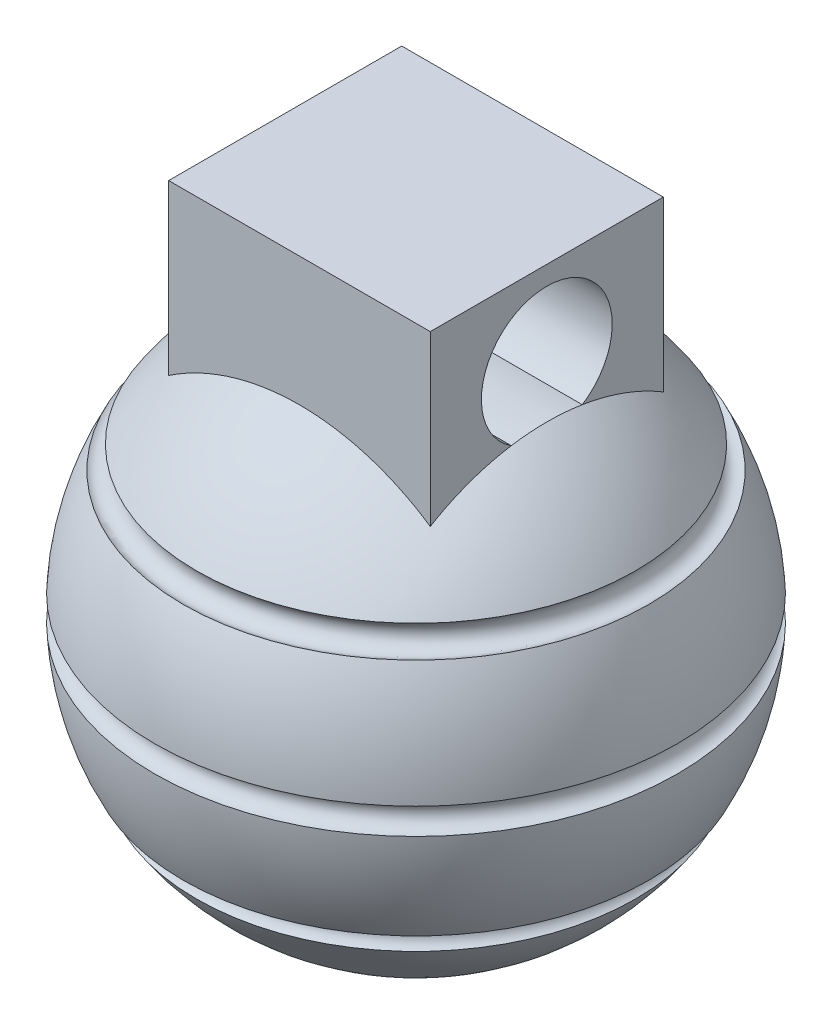
ISO-10303-21;
HEADER;
FILE_DESCRIPTION(('STEP AP214'),'2;1');
FILE_NAME('part.step','',(''),(''),'','','');
FILE_SCHEMA(('AUTOMOTIVE_DESIGN { 1 0 10303 214 1 1 1 1 }'));
ENDSEC;
DATA;
#1=APPLICATION_CONTEXT('core data for automotive mechanical design processes');
#2=APPLICATION_PROTOCOL_DEFINITION('international standard','automotive_design',2000,#1);
#3=PRODUCT_CONTEXT('',#1,'mechanical');
#4=PRODUCT('Part','Part','',(#3));
#5=PRODUCT_RELATED_PRODUCT_CATEGORY('part','',(#4));
#6=PRODUCT_DEFINITION_FORMATION('','',#4);
#7=PRODUCT_DEFINITION_CONTEXT('part definition',#1,'design');
#8=PRODUCT_DEFINITION('design','',#6,#7);
#9=PRODUCT_DEFINITION_SHAPE('','',#8);
#10=(LENGTH_UNIT() NAMED_UNIT(*) SI_UNIT(.MILLI.,.METRE.));
#11=(NAMED_UNIT(*) PLANE_ANGLE_UNIT() SI_UNIT($,.RADIAN.));
#12=(NAMED_UNIT(*) SI_UNIT($,.STERADIAN.) SOLID_ANGLE_UNIT());
#13=UNCERTAINTY_MEASURE_WITH_UNIT(LENGTH_MEASURE(1.E-05),#10,'distance_accuracy_value','');
#14=(GEOMETRIC_REPRESENTATION_CONTEXT(3) GLOBAL_UNCERTAINTY_ASSIGNED_CONTEXT((#13)) GLOBAL_UNIT_ASSIGNED_CONTEXT((#10,
#11,#12)) REPRESENTATION_CONTEXT('',''));
#15=CARTESIAN_POINT('',(0.,0.,0.));
#16=DIRECTION('',(0.,0.,1.));
#17=DIRECTION('',(1.,0.,0.));
#18=AXIS2_PLACEMENT_3D('',#15,#16,#17);
#19=CARTESIAN_POINT('',(0.,0.,0.));
#20=DIRECTION('',(0.,1.,0.));
#21=DIRECTION('',(1.,0.,0.));
#22=AXIS2_PLACEMENT_3D('',#19,#20,#21);
#23=SPHERICAL_SURFACE('',#22,20.);
#24=CARTESIAN_POINT('',(0.,10.8625251832745,0.));
#25=DIRECTION('',(0.,1.,0.));
#26=DIRECTION('',(0.,0.,1.));
#27=AXIS2_PLACEMENT_3D('',#24,#25,#26);
#28=CIRCLE('',#27,16.7930207718185);
#29=CARTESIAN_POINT('',(0.,10.8625251832745,16.7930207718187));
#30=VERTEX_POINT('',#29);
#31=EDGE_CURVE('E179',#30,#30,#28,.F.);
#32=ORIENTED_EDGE('',*,*,#31,.F.);
#33=EDGE_LOOP('',(#32));
#34=FACE_BOUND('',#33,.T.);
#35=CARTESIAN_POINT('',(0.,0.,8.90842301543771));
#36=DIRECTION('',(0.,0.,1.));
#37=DIRECTION('',(1.,0.,0.));
#38=AXIS2_PLACEMENT_3D('',#35,#36,#37);
#39=CIRCLE('',#38,17.906423411112);
#40=CARTESIAN_POINT('',(-10.,14.8539556811652,8.90842301543771));
#41=VERTEX_POINT('',#40);
#42=CARTESIAN_POINT('',(10.,14.8539556811652,8.90842301543771));
#43=VERTEX_POINT('',#42);
#44=EDGE_CURVE('E129',#41,#43,#39,.F.);
#45=ORIENTED_EDGE('',*,*,#44,.F.);
#46=CARTESIAN_POINT('',(-10.,0.,0.));
#47=DIRECTION('',(1.,0.,0.));
#48=DIRECTION('',(0.,0.,-1.));
#49=AXIS2_PLACEMENT_3D('',#46,#47,#48);
#50=CIRCLE('',#49,17.3205080756888);
#51=CARTESIAN_POINT('',(-10.,17.1065860529649,2.71380058451392));
#52=VERTEX_POINT('',#51);
#53=EDGE_CURVE('E11',#41,#52,#50,.F.);
#54=ORIENTED_EDGE('',*,*,#53,.T.);
#55=CARTESIAN_POINT('',(-10.,0.,0.));
#56=DIRECTION('',(1.,0.,0.));
#57=DIRECTION('',(0.,0.,-1.));
#58=AXIS2_PLACEMENT_3D('',#55,#56,#57);
#59=CIRCLE('',#58,17.3205080756888);
#60=CARTESIAN_POINT('',(-10.,17.1065860529649,-2.71380058451392));
#61=VERTEX_POINT('',#60);
#62=EDGE_CURVE('E106',#52,#61,#59,.F.);
#63=ORIENTED_EDGE('',*,*,#62,.T.);
#64=CARTESIAN_POINT('',(-10.,14.8539556811652,-8.9084230154377));
#65=VERTEX_POINT('',#64);
#66=EDGE_CURVE('E43',#61,#65,#50,.F.);
#67=ORIENTED_EDGE('',*,*,#66,.T.);
#68=CARTESIAN_POINT('',(0.,0.,-8.9084230154377));
#69=DIRECTION('',(0.,0.,-1.));
#70=DIRECTION('',(-1.,0.,0.));
#71=AXIS2_PLACEMENT_3D('',#68,#69,#70);
#72=CIRCLE('',#71,17.906423411112);
#73=CARTESIAN_POINT('',(10.,14.8539556811652,-8.9084230154377));
#74=VERTEX_POINT('',#73);
#75=EDGE_CURVE('E131',#74,#65,#72,.F.);
#76=ORIENTED_EDGE('',*,*,#75,.F.);
#77=CARTESIAN_POINT('',(10.,0.,0.));
#78=DIRECTION('',(1.,0.,0.));
#79=DIRECTION('',(0.,0.,-1.));
#80=AXIS2_PLACEMENT_3D('',#77,#78,#79);
#81=CIRCLE('',#80,17.3205080756888);
#82=CARTESIAN_POINT('',(10.,17.1065860529649,-2.71380058451392));
#83=VERTEX_POINT('',#82);
#84=EDGE_CURVE('E122',#83,#74,#81,.F.);
#85=ORIENTED_EDGE('',*,*,#84,.F.);
#86=CARTESIAN_POINT('',(10.,0.,0.));
#87=DIRECTION('',(1.,0.,0.));
#88=DIRECTION('',(0.,0.,-1.));
#89=AXIS2_PLACEMENT_3D('',#86,#87,#88);
#90=CIRCLE('',#89,17.3205080756888);
#91=CARTESIAN_POINT('',(10.,17.1065860529649,2.71380058451392));
#92=VERTEX_POINT('',#91);
#93=EDGE_CURVE('E57',#92,#83,#90,.F.);
#94=ORIENTED_EDGE('',*,*,#93,.F.);
#95=EDGE_CURVE('E119',#43,#92,#81,.F.);
#96=ORIENTED_EDGE('',*,*,#95,.F.);
#97=EDGE_LOOP('',(#45,#54,#63,#67,#76,#85,#94,#96));
#98=FACE_BOUND('',#97,.T.);
#99=ADVANCED_FACE('F35',(#34,#98),#23,.T.);
#100=CARTESIAN_POINT('',(0.,9.13104765139323,0.));
#101=DIRECTION('',(0.,-1.,0.));
#102=DIRECTION('',(0.,0.,-1.));
#103=AXIS2_PLACEMENT_3D('',#100,#101,#102);
#104=CIRCLE('',#103,17.793930672788);
#105=CARTESIAN_POINT('',(0.,9.13104765139323,17.7939306727878));
#106=VERTEX_POINT('',#105);
#107=EDGE_CURVE('E176',#106,#106,#104,.F.);
#108=ORIENTED_EDGE('',*,*,#107,.F.);
#109=EDGE_LOOP('',(#108));
#110=FACE_BOUND('',#109,.T.);
#111=CARTESIAN_POINT('',(0.,0.999687451156624,0.));
#112=DIRECTION('',(0.,1.,0.));
#113=DIRECTION('',(0.,0.,1.));
#114=AXIS2_PLACEMENT_3D('',#111,#112,#113);
#115=CIRCLE('',#114,19.975);
#116=CARTESIAN_POINT('',(19.9750000000002,0.999687451156624,0.));
#117=VERTEX_POINT('',#116);
#118=EDGE_CURVE('E173',#117,#117,#115,.T.);
#119=ORIENTED_EDGE('',*,*,#118,.T.);
#120=EDGE_LOOP('',(#119));
#121=FACE_BOUND('',#120,.T.);
#122=ADVANCED_FACE('F37',(#110,#121),#23,.T.);
#123=CARTESIAN_POINT('',(0.,0.,0.));
#124=DIRECTION('',(0.,1.,0.));
#125=DIRECTION('',(0.,0.,1.));
#126=AXIS2_PLACEMENT_3D('',#123,#124,#125);
#127=TOROIDAL_SURFACE('',#126,20.,1.);
#128=CARTESIAN_POINT('',(20.,0.,0.));
#129=DIRECTION('',(0.,0.,1.));
#130=DIRECTION('',(1.,0.,0.));
#131=AXIS2_PLACEMENT_3D('',#128,#129,#130);
#132=CIRCLE('',#131,1.);
#133=CARTESIAN_POINT('',(19.9750000000002,-0.999687451156624,0.));
#134=VERTEX_POINT('',#133);
#135=EDGE_CURVE('E168',#117,#134,#132,.T.);
#136=ORIENTED_EDGE('',*,*,#135,.T.);
#137=CARTESIAN_POINT('',(0.,-0.999687451156624,0.));
#138=DIRECTION('',(0.,-1.,0.));
#139=DIRECTION('',(0.,0.,-1.));
#140=AXIS2_PLACEMENT_3D('',#137,#138,#139);
#141=CIRCLE('',#140,19.975);
#142=EDGE_CURVE('E170',#134,#134,#141,.T.);
#143=ORIENTED_EDGE('',*,*,#142,.F.);
#144=ORIENTED_EDGE('',*,*,#135,.F.);
#145=ORIENTED_EDGE('',*,*,#118,.F.);
#146=EDGE_LOOP('',(#136,#143,#144,#145));
#147=FACE_BOUND('',#146,.T.);
#148=ADVANCED_FACE('F203',(#147),#127,.F.);
#149=CARTESIAN_POINT('',(0.,-9.13104765139323,0.));
#150=DIRECTION('',(0.,1.,0.));
#151=DIRECTION('',(0.,0.,1.));
#152=AXIS2_PLACEMENT_3D('',#149,#150,#151);
#153=CIRCLE('',#152,17.793930672788);
#154=CARTESIAN_POINT('',(0.,-9.13104765139323,17.7939306727878));
#155=VERTEX_POINT('',#154);
#156=EDGE_CURVE('E181',#155,#155,#153,.F.);
#157=ORIENTED_EDGE('',*,*,#156,.F.);
#158=EDGE_LOOP('',(#157));
#159=FACE_BOUND('',#158,.T.);
#160=ORIENTED_EDGE('',*,*,#142,.T.);
#161=EDGE_LOOP('',(#160));
#162=FACE_BOUND('',#161,.T.);
#163=ADVANCED_FACE('F192',(#159,#162),#23,.T.);
#164=CARTESIAN_POINT('',(0.,10.,0.));
#165=DIRECTION('',(0.,1.,0.));
#166=DIRECTION('',(0.,0.,1.));
#167=AXIS2_PLACEMENT_3D('',#164,#165,#166);
#168=TOROIDAL_SURFACE('',#167,17.2990349101761,1.);
#169=ORIENTED_EDGE('',*,*,#31,.T.);
#170=CARTESIAN_POINT('',(0.,10.,17.2990349101761));
#171=DIRECTION('',(1.,0.,0.));
#172=DIRECTION('',(0.,0.,-1.));
#173=AXIS2_PLACEMENT_3D('',#170,#171,#172);
#174=CIRCLE('',#173,1.);
#175=EDGE_CURVE('E166',#106,#30,#174,.T.);
#176=ORIENTED_EDGE('',*,*,#175,.F.);
#177=ORIENTED_EDGE('',*,*,#107,.T.);
#178=ORIENTED_EDGE('',*,*,#175,.T.);
#179=EDGE_LOOP('',(#169,#176,#177,#178));
#180=FACE_BOUND('',#179,.T.);
#181=ADVANCED_FACE('F200',(#180),#168,.F.);
#182=CARTESIAN_POINT('',(0.,-10.,0.));
#183=DIRECTION('',(0.,1.,0.));
#184=DIRECTION('',(0.,0.,1.));
#185=AXIS2_PLACEMENT_3D('',#182,#183,#184);
#186=TOROIDAL_SURFACE('',#185,17.2990349101761,1.);
#187=CARTESIAN_POINT('',(0.,-10.8625251832745,0.));
#188=DIRECTION('',(0.,-1.,0.));
#189=DIRECTION('',(0.,0.,-1.));
#190=AXIS2_PLACEMENT_3D('',#187,#188,#189);
#191=CIRCLE('',#190,16.7930207718185);
#192=CARTESIAN_POINT('',(0.,-10.8625251832745,16.7930207718187));
#193=VERTEX_POINT('',#192);
#194=EDGE_CURVE('E133',#193,#193,#191,.F.);
#195=ORIENTED_EDGE('',*,*,#194,.T.);
#196=CARTESIAN_POINT('',(0.,-10.,17.2990349101761));
#197=DIRECTION('',(-1.,0.,0.));
#198=DIRECTION('',(0.,0.,-1.));
#199=AXIS2_PLACEMENT_3D('',#196,#197,#198);
#200=CIRCLE('',#199,1.);
#201=EDGE_CURVE('E163',#193,#155,#200,.F.);
#202=ORIENTED_EDGE('',*,*,#201,.T.);
#203=ORIENTED_EDGE('',*,*,#156,.T.);
#204=ORIENTED_EDGE('',*,*,#201,.F.);
#205=EDGE_LOOP('',(#195,#202,#203,#204));
#206=FACE_BOUND('',#205,.T.);
#207=ADVANCED_FACE('F187',(#206),#186,.F.);
#208=ORIENTED_EDGE('',*,*,#194,.F.);
#209=EDGE_LOOP('',(#208));
#210=FACE_BOUND('',#209,.T.);
#211=ADVANCED_FACE('F189',(#210),#23,.T.);
#212=CARTESIAN_POINT('',(-10.,27.75809406109,-8.9084230154377));
#213=DIRECTION('',(0.,0.,-1.));
#214=DIRECTION('',(-1.,0.,0.));
#215=AXIS2_PLACEMENT_3D('',#212,#213,#214);
#216=PLANE('',#215);
#217=DIRECTION('',(0.,1.,0.));
#218=VECTOR('',#217,1.);
#219=CARTESIAN_POINT('',(10.,27.75809406109,-8.9084230154377));
#220=LINE('',#219,#218);
#221=CARTESIAN_POINT('',(10.,27.75809406109,-8.9084230154377));
#222=VERTEX_POINT('',#221);
#223=EDGE_CURVE('E317',#74,#222,#220,.T.);
#224=ORIENTED_EDGE('',*,*,#223,.F.);
#225=ORIENTED_EDGE('',*,*,#75,.T.);
#226=DIRECTION('',(0.,1.,0.));
#227=VECTOR('',#226,1.);
#228=CARTESIAN_POINT('',(-10.,27.75809406109,-8.9084230154377));
#229=LINE('',#228,#227);
#230=CARTESIAN_POINT('',(-10.,27.75809406109,-8.9084230154377));
#231=VERTEX_POINT('',#230);
#232=EDGE_CURVE('E145',#65,#231,#229,.T.);
#233=ORIENTED_EDGE('',*,*,#232,.T.);
#234=DIRECTION('',(1.,0.,0.));
#235=VECTOR('',#234,1.);
#236=CARTESIAN_POINT('',(-10.,27.75809406109,-8.9084230154377));
#237=LINE('',#236,#235);
#238=EDGE_CURVE('E160',#231,#222,#237,.T.);
#239=ORIENTED_EDGE('',*,*,#238,.T.);
#240=EDGE_LOOP('',(#224,#225,#233,#239));
#241=FACE_BOUND('',#240,.T.);
#242=ADVANCED_FACE('F191',(#241),#216,.T.);
#243=CARTESIAN_POINT('',(-10.,27.75809406109,8.90842301543771));
#244=DIRECTION('',(0.,0.,1.));
#245=DIRECTION('',(1.,0.,0.));
#246=AXIS2_PLACEMENT_3D('',#243,#244,#245);
#247=PLANE('',#246);
#248=DIRECTION('',(0.,-1.,0.));
#249=VECTOR('',#248,1.);
#250=CARTESIAN_POINT('',(-10.,27.75809406109,8.90842301543771));
#251=LINE('',#250,#249);
#252=CARTESIAN_POINT('',(-10.,27.75809406109,8.90842301543771));
#253=VERTEX_POINT('',#252);
#254=EDGE_CURVE('E152',#253,#41,#251,.T.);
#255=ORIENTED_EDGE('',*,*,#254,.T.);
#256=ORIENTED_EDGE('',*,*,#44,.T.);
#257=DIRECTION('',(0.,-1.,0.));
#258=VECTOR('',#257,1.);
#259=CARTESIAN_POINT('',(10.,27.75809406109,8.90842301543771));
#260=LINE('',#259,#258);
#261=CARTESIAN_POINT('',(10.,27.75809406109,8.90842301543771));
#262=VERTEX_POINT('',#261);
#263=EDGE_CURVE('E128',#262,#43,#260,.T.);
#264=ORIENTED_EDGE('',*,*,#263,.F.);
#265=DIRECTION('',(1.,0.,0.));
#266=VECTOR('',#265,1.);
#267=CARTESIAN_POINT('',(-10.,27.75809406109,8.90842301543771));
#268=LINE('',#267,#266);
#269=EDGE_CURVE('E161',#253,#262,#268,.T.);
#270=ORIENTED_EDGE('',*,*,#269,.F.);
#271=EDGE_LOOP('',(#255,#256,#264,#270));
#272=FACE_BOUND('',#271,.T.);
#273=ADVANCED_FACE('F198',(#272),#247,.T.);
#274=CARTESIAN_POINT('',(-10.,27.75809406109,8.90842301543771));
#275=DIRECTION('',(0.,1.,0.));
#276=DIRECTION('',(0.,0.,1.));
#277=AXIS2_PLACEMENT_3D('',#274,#275,#276);
#278=PLANE('',#277);
#279=ORIENTED_EDGE('',*,*,#269,.T.);
#280=DIRECTION('',(0.,0.,1.));
#281=VECTOR('',#280,1.);
#282=CARTESIAN_POINT('',(10.,27.75809406109,8.90842301543771));
#283=LINE('',#282,#281);
#284=EDGE_CURVE('E154',#222,#262,#283,.T.);
#285=ORIENTED_EDGE('',*,*,#284,.F.);
#286=ORIENTED_EDGE('',*,*,#238,.F.);
#287=DIRECTION('',(0.,0.,1.));
#288=VECTOR('',#287,1.);
#289=CARTESIAN_POINT('',(-10.,27.75809406109,8.90842301543771));
#290=LINE('',#289,#288);
#291=EDGE_CURVE('E148',#231,#253,#290,.T.);
#292=ORIENTED_EDGE('',*,*,#291,.T.);
#293=EDGE_LOOP('',(#279,#285,#286,#292));
#294=FACE_BOUND('',#293,.T.);
#295=ADVANCED_FACE('F227',(#294),#278,.T.);
#296=CARTESIAN_POINT('',(-10.,0.,0.));
#297=DIRECTION('',(1.,0.,0.));
#298=DIRECTION('',(0.,0.,-1.));
#299=AXIS2_PLACEMENT_3D('',#296,#297,#298);
#300=PLANE('',#299);
#301=ORIENTED_EDGE('',*,*,#66,.F.);
#302=CARTESIAN_POINT('',(-10.,21.3060248711276,0.));
#303=DIRECTION('',(1.,0.,0.));
#304=DIRECTION('',(0.,0.,-1.));
#305=AXIS2_PLACEMENT_3D('',#302,#303,#304);
#306=CIRCLE('',#305,5.);
#307=EDGE_CURVE('E108',#61,#52,#306,.T.);
#308=ORIENTED_EDGE('',*,*,#307,.T.);
#309=ORIENTED_EDGE('',*,*,#53,.F.);
#310=ORIENTED_EDGE('',*,*,#254,.F.);
#311=ORIENTED_EDGE('',*,*,#291,.F.);
#312=ORIENTED_EDGE('',*,*,#232,.F.);
#313=EDGE_LOOP('',(#301,#308,#309,#310,#311,#312));
#314=FACE_BOUND('',#313,.T.);
#315=ADVANCED_FACE('F142',(#314),#300,.F.);
#316=CARTESIAN_POINT('',(10.,0.,0.));
#317=DIRECTION('',(1.,0.,0.));
#318=DIRECTION('',(0.,0.,-1.));
#319=AXIS2_PLACEMENT_3D('',#316,#317,#318);
#320=PLANE('',#319);
#321=CARTESIAN_POINT('',(10.,21.3060248711276,0.));
#322=DIRECTION('',(1.,0.,0.));
#323=DIRECTION('',(0.,0.,-1.));
#324=AXIS2_PLACEMENT_3D('',#321,#322,#323);
#325=CIRCLE('',#324,5.);
#326=EDGE_CURVE('E112',#83,#92,#325,.T.);
#327=ORIENTED_EDGE('',*,*,#326,.F.);
#328=ORIENTED_EDGE('',*,*,#84,.T.);
#329=ORIENTED_EDGE('',*,*,#223,.T.);
#330=ORIENTED_EDGE('',*,*,#284,.T.);
#331=ORIENTED_EDGE('',*,*,#263,.T.);
#332=ORIENTED_EDGE('',*,*,#95,.T.);
#333=EDGE_LOOP('',(#327,#328,#329,#330,#331,#332));
#334=FACE_BOUND('',#333,.T.);
#335=ADVANCED_FACE('F125',(#334),#320,.T.);
#336=CARTESIAN_POINT('',(-19.975,0.,0.));
#337=DIRECTION('',(1.,0.,0.));
#338=DIRECTION('',(0.,0.,-1.));
#339=AXIS2_PLACEMENT_3D('',#336,#337,#338);
#340=CYLINDRICAL_SURFACE('',#339,17.3205080756888);
#341=DIRECTION('',(1.,0.,0.));
#342=VECTOR('',#341,1.);
#343=CARTESIAN_POINT('',(-19.975,17.1065860529649,2.71380058451392));
#344=LINE('',#343,#342);
#345=EDGE_CURVE('E50',#52,#92,#344,.T.);
#346=ORIENTED_EDGE('',*,*,#345,.T.);
#347=ORIENTED_EDGE('',*,*,#93,.T.);
#348=DIRECTION('',(1.,0.,0.));
#349=VECTOR('',#348,1.);
#350=CARTESIAN_POINT('',(-19.975,17.1065860529649,-2.71380058451392));
#351=LINE('',#350,#349);
#352=EDGE_CURVE('E109',#61,#83,#351,.T.);
#353=ORIENTED_EDGE('',*,*,#352,.F.);
#354=ORIENTED_EDGE('',*,*,#62,.F.);
#355=EDGE_LOOP('',(#346,#347,#353,#354));
#356=FACE_BOUND('',#355,.T.);
#357=ADVANCED_FACE('F104',(#356),#340,.T.);
#358=CARTESIAN_POINT('',(-19.975,21.3060248711276,0.));
#359=DIRECTION('',(1.,0.,0.));
#360=DIRECTION('',(0.,0.,-1.));
#361=AXIS2_PLACEMENT_3D('',#358,#359,#360);
#362=CYLINDRICAL_SURFACE('',#361,5.);
#363=ORIENTED_EDGE('',*,*,#352,.T.);
#364=ORIENTED_EDGE('',*,*,#326,.T.);
#365=ORIENTED_EDGE('',*,*,#345,.F.);
#366=ORIENTED_EDGE('',*,*,#307,.F.);
#367=EDGE_LOOP('',(#363,#364,#365,#366));
#368=FACE_BOUND('',#367,.T.);
#369=ADVANCED_FACE('F113',(#368),#362,.F.);
#370=CLOSED_SHELL('',(#99,#122,#148,#163,#181,#207,#211,#242,#273,#295,#315,#335,#357,#369));
#371=MANIFOLD_SOLID_BREP('B2',#370);
#372=ADVANCED_BREP_SHAPE_REPRESENTATION('',(#18,#371),#14);
#373=SHAPE_DEFINITION_REPRESENTATION(#9,#372);
ENDSEC;
END-ISO-10303-21;
